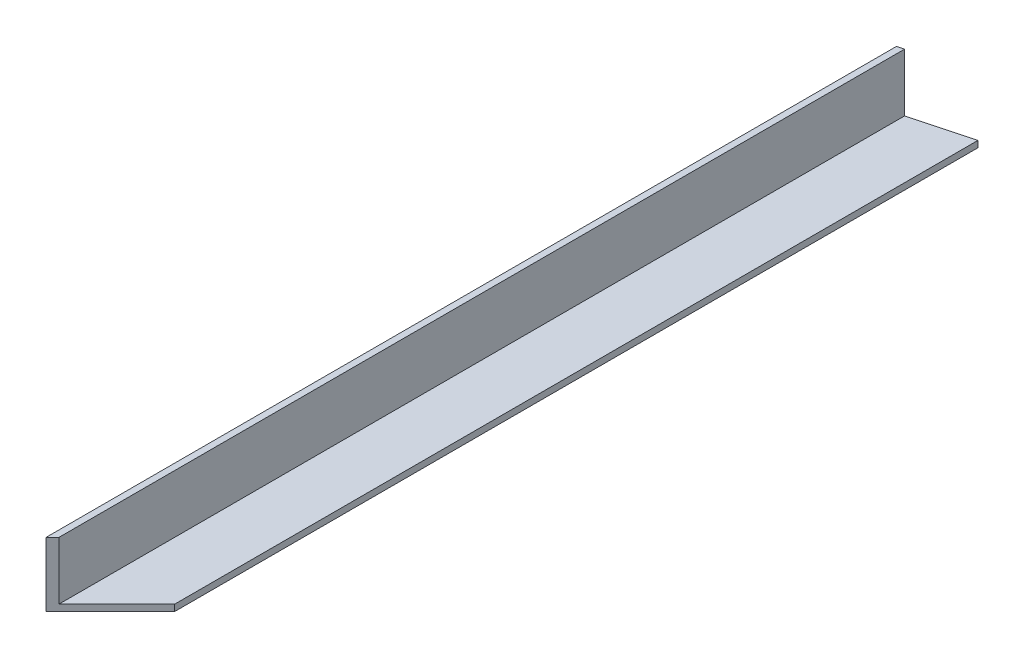
ISO-10303-21;
HEADER;
FILE_DESCRIPTION(('STEP AP214'),'2;1');
FILE_NAME('part.step','',(''),(''),'','','');
FILE_SCHEMA(('AUTOMOTIVE_DESIGN { 1 0 10303 214 1 1 1 1 }'));
ENDSEC;
DATA;
#1=APPLICATION_CONTEXT('core data for automotive mechanical design processes');
#2=APPLICATION_PROTOCOL_DEFINITION('international standard','automotive_design',2000,#1);
#3=PRODUCT_CONTEXT('',#1,'mechanical');
#4=PRODUCT('Part','Part','',(#3));
#5=PRODUCT_RELATED_PRODUCT_CATEGORY('part','',(#4));
#6=PRODUCT_DEFINITION_FORMATION('','',#4);
#7=PRODUCT_DEFINITION_CONTEXT('part definition',#1,'design');
#8=PRODUCT_DEFINITION('design','',#6,#7);
#9=PRODUCT_DEFINITION_SHAPE('','',#8);
#10=(LENGTH_UNIT() NAMED_UNIT(*) SI_UNIT(.MILLI.,.METRE.));
#11=(NAMED_UNIT(*) PLANE_ANGLE_UNIT() SI_UNIT($,.RADIAN.));
#12=(NAMED_UNIT(*) SI_UNIT($,.STERADIAN.) SOLID_ANGLE_UNIT());
#13=UNCERTAINTY_MEASURE_WITH_UNIT(LENGTH_MEASURE(1.E-05),#10,'distance_accuracy_value','');
#14=(GEOMETRIC_REPRESENTATION_CONTEXT(3) GLOBAL_UNCERTAINTY_ASSIGNED_CONTEXT((#13)) GLOBAL_UNIT_ASSIGNED_CONTEXT((#10,
#11,#12)) REPRESENTATION_CONTEXT('',''));
#15=CARTESIAN_POINT('',(0.,0.,0.));
#16=DIRECTION('',(0.,0.,1.));
#17=DIRECTION('',(1.,0.,0.));
#18=AXIS2_PLACEMENT_3D('',#15,#16,#17);
#19=CARTESIAN_POINT('',(12.7,0.,171.45));
#20=DIRECTION('',(0.,1.,0.));
#21=DIRECTION('',(-1.,0.,0.));
#22=AXIS2_PLACEMENT_3D('',#19,#20,#21);
#23=PLANE('',#22);
#24=DIRECTION('',(0.,0.,-1.));
#25=VECTOR('',#24,1.);
#26=CARTESIAN_POINT('',(12.7,0.,171.45));
#27=LINE('',#26,#25);
#28=CARTESIAN_POINT('',(12.7,0.,158.75));
#29=VERTEX_POINT('',#28);
#30=CARTESIAN_POINT('',(12.7,0.,0.));
#31=VERTEX_POINT('',#30);
#32=EDGE_CURVE('E11',#29,#31,#27,.T.);
#33=ORIENTED_EDGE('',*,*,#32,.F.);
#34=DIRECTION('',(-0.707106781186551,0.,0.707106781186544));
#35=VECTOR('',#34,1.);
#36=CARTESIAN_POINT('',(0.,0.,171.45));
#37=LINE('',#36,#35);
#38=CARTESIAN_POINT('',(0.,0.,171.45));
#39=VERTEX_POINT('',#38);
#40=EDGE_CURVE('E79',#29,#39,#37,.T.);
#41=ORIENTED_EDGE('',*,*,#40,.T.);
#42=DIRECTION('',(0.,0.,-1.));
#43=VECTOR('',#42,1.);
#44=CARTESIAN_POINT('',(0.,0.,171.45));
#45=LINE('',#44,#43);
#46=CARTESIAN_POINT('',(0.,0.,3.40295474387517));
#47=VERTEX_POINT('',#46);
#48=EDGE_CURVE('E100',#39,#47,#45,.T.);
#49=ORIENTED_EDGE('',*,*,#48,.T.);
#50=DIRECTION('',(0.96592582628907,0.,-0.258819045102514));
#51=VECTOR('',#50,1.);
#52=CARTESIAN_POINT('',(12.7,0.,0.));
#53=LINE('',#52,#51);
#54=EDGE_CURVE('E99',#47,#31,#53,.T.);
#55=ORIENTED_EDGE('',*,*,#54,.T.);
#56=EDGE_LOOP('',(#33,#41,#49,#55));
#57=FACE_BOUND('',#56,.T.);
#58=ADVANCED_FACE('F33',(#57),#23,.F.);
#59=CARTESIAN_POINT('',(12.7,1.27,171.45));
#60=DIRECTION('',(-1.,0.,0.));
#61=DIRECTION('',(0.,0.,1.));
#62=AXIS2_PLACEMENT_3D('',#59,#60,#61);
#63=PLANE('',#62);
#64=DIRECTION('',(0.,0.,-1.));
#65=VECTOR('',#64,1.);
#66=CARTESIAN_POINT('',(12.7,1.27,171.45));
#67=LINE('',#66,#65);
#68=CARTESIAN_POINT('',(12.7,1.27,158.75));
#69=VERTEX_POINT('',#68);
#70=CARTESIAN_POINT('',(12.7,1.27,0.));
#71=VERTEX_POINT('',#70);
#72=EDGE_CURVE('E41',#69,#71,#67,.T.);
#73=ORIENTED_EDGE('',*,*,#72,.F.);
#74=DIRECTION('',(0.,1.,0.));
#75=VECTOR('',#74,1.);
#76=CARTESIAN_POINT('',(12.7,0.,158.75));
#77=LINE('',#76,#75);
#78=EDGE_CURVE('E82',#29,#69,#77,.T.);
#79=ORIENTED_EDGE('',*,*,#78,.F.);
#80=ORIENTED_EDGE('',*,*,#32,.T.);
#81=DIRECTION('',(0.,1.,0.));
#82=VECTOR('',#81,1.);
#83=CARTESIAN_POINT('',(12.7,1.27,0.));
#84=LINE('',#83,#82);
#85=EDGE_CURVE('E119',#31,#71,#84,.T.);
#86=ORIENTED_EDGE('',*,*,#85,.T.);
#87=EDGE_LOOP('',(#73,#79,#80,#86));
#88=FACE_BOUND('',#87,.T.);
#89=ADVANCED_FACE('F93',(#88),#63,.F.);
#90=CARTESIAN_POINT('',(1.27,1.27,171.45));
#91=DIRECTION('',(0.,-1.,0.));
#92=DIRECTION('',(1.,0.,0.));
#93=AXIS2_PLACEMENT_3D('',#90,#91,#92);
#94=PLANE('',#93);
#95=DIRECTION('',(0.,0.,-1.));
#96=VECTOR('',#95,1.);
#97=CARTESIAN_POINT('',(1.27,1.27,171.45));
#98=LINE('',#97,#96);
#99=CARTESIAN_POINT('',(1.27,1.27,170.18));
#100=VERTEX_POINT('',#99);
#101=CARTESIAN_POINT('',(1.27,1.27,3.06265926948765));
#102=VERTEX_POINT('',#101);
#103=EDGE_CURVE('E129',#100,#102,#98,.T.);
#104=ORIENTED_EDGE('',*,*,#103,.F.);
#105=DIRECTION('',(0.707106781186551,0.,-0.707106781186544));
#106=VECTOR('',#105,1.);
#107=CARTESIAN_POINT('',(0.635000000000006,1.27,170.815));
#108=LINE('',#107,#106);
#109=EDGE_CURVE('E117',#100,#69,#108,.T.);
#110=ORIENTED_EDGE('',*,*,#109,.T.);
#111=ORIENTED_EDGE('',*,*,#72,.T.);
#112=DIRECTION('',(-0.96592582628907,0.,0.258819045102514));
#113=VECTOR('',#112,1.);
#114=CARTESIAN_POINT('',(-40.8268351826271,1.27,14.3424722605784));
#115=LINE('',#114,#113);
#116=EDGE_CURVE('E111',#71,#102,#115,.T.);
#117=ORIENTED_EDGE('',*,*,#116,.T.);
#118=EDGE_LOOP('',(#104,#110,#111,#117));
#119=FACE_BOUND('',#118,.T.);
#120=ADVANCED_FACE('F133',(#119),#94,.F.);
#121=CARTESIAN_POINT('',(1.27,12.7,171.45));
#122=DIRECTION('',(-1.,0.,0.));
#123=DIRECTION('',(0.,-1.,0.));
#124=AXIS2_PLACEMENT_3D('',#121,#122,#123);
#125=PLANE('',#124);
#126=DIRECTION('',(0.,0.,-1.));
#127=VECTOR('',#126,1.);
#128=CARTESIAN_POINT('',(1.27,12.7,171.45));
#129=LINE('',#128,#127);
#130=CARTESIAN_POINT('',(1.27,12.7,170.18));
#131=VERTEX_POINT('',#130);
#132=CARTESIAN_POINT('',(1.27,12.7,3.06265926948765));
#133=VERTEX_POINT('',#132);
#134=EDGE_CURVE('E126',#131,#133,#129,.T.);
#135=ORIENTED_EDGE('',*,*,#134,.F.);
#136=DIRECTION('',(0.,-1.,0.));
#137=VECTOR('',#136,1.);
#138=CARTESIAN_POINT('',(1.27,12.7,170.18));
#139=LINE('',#138,#137);
#140=EDGE_CURVE('E114',#131,#100,#139,.T.);
#141=ORIENTED_EDGE('',*,*,#140,.T.);
#142=ORIENTED_EDGE('',*,*,#103,.T.);
#143=DIRECTION('',(0.,1.,0.));
#144=VECTOR('',#143,1.);
#145=CARTESIAN_POINT('',(1.27,12.7,3.06265926948765));
#146=LINE('',#145,#144);
#147=EDGE_CURVE('E96',#102,#133,#146,.T.);
#148=ORIENTED_EDGE('',*,*,#147,.T.);
#149=EDGE_LOOP('',(#135,#141,#142,#148));
#150=FACE_BOUND('',#149,.T.);
#151=ADVANCED_FACE('F138',(#150),#125,.F.);
#152=CARTESIAN_POINT('',(0.,12.7,171.45));
#153=DIRECTION('',(0.,-1.,0.));
#154=DIRECTION('',(0.,0.,-1.));
#155=AXIS2_PLACEMENT_3D('',#152,#153,#154);
#156=PLANE('',#155);
#157=DIRECTION('',(0.,0.,-1.));
#158=VECTOR('',#157,1.);
#159=CARTESIAN_POINT('',(0.,12.7,171.45));
#160=LINE('',#159,#158);
#161=CARTESIAN_POINT('',(0.,12.7,171.45));
#162=VERTEX_POINT('',#161);
#163=CARTESIAN_POINT('',(0.,12.7,3.40295474387517));
#164=VERTEX_POINT('',#163);
#165=EDGE_CURVE('E123',#162,#164,#160,.T.);
#166=ORIENTED_EDGE('',*,*,#165,.F.);
#167=DIRECTION('',(-0.707106781186551,0.,0.707106781186544));
#168=VECTOR('',#167,1.);
#169=CARTESIAN_POINT('',(0.,12.7,171.45));
#170=LINE('',#169,#168);
#171=EDGE_CURVE('E47',#131,#162,#170,.T.);
#172=ORIENTED_EDGE('',*,*,#171,.F.);
#173=ORIENTED_EDGE('',*,*,#134,.T.);
#174=DIRECTION('',(0.96592582628907,0.,-0.258819045102514));
#175=VECTOR('',#174,1.);
#176=CARTESIAN_POINT('',(12.7,12.7,0.));
#177=LINE('',#176,#175);
#178=EDGE_CURVE('E104',#164,#133,#177,.T.);
#179=ORIENTED_EDGE('',*,*,#178,.F.);
#180=EDGE_LOOP('',(#166,#172,#173,#179));
#181=FACE_BOUND('',#180,.T.);
#182=ADVANCED_FACE('F140',(#181),#156,.F.);
#183=CARTESIAN_POINT('',(0.,0.,171.45));
#184=DIRECTION('',(1.,0.,0.));
#185=DIRECTION('',(0.,0.,-1.));
#186=AXIS2_PLACEMENT_3D('',#183,#184,#185);
#187=PLANE('',#186);
#188=ORIENTED_EDGE('',*,*,#165,.T.);
#189=DIRECTION('',(0.,1.,0.));
#190=VECTOR('',#189,1.);
#191=CARTESIAN_POINT('',(0.,0.,3.40295474387517));
#192=LINE('',#191,#190);
#193=EDGE_CURVE('E103',#47,#164,#192,.T.);
#194=ORIENTED_EDGE('',*,*,#193,.F.);
#195=ORIENTED_EDGE('',*,*,#48,.F.);
#196=DIRECTION('',(0.,-1.,0.));
#197=VECTOR('',#196,1.);
#198=CARTESIAN_POINT('',(0.,0.,171.45));
#199=LINE('',#198,#197);
#200=EDGE_CURVE('E85',#162,#39,#199,.T.);
#201=ORIENTED_EDGE('',*,*,#200,.F.);
#202=EDGE_LOOP('',(#188,#194,#195,#201));
#203=FACE_BOUND('',#202,.T.);
#204=ADVANCED_FACE('F143',(#203),#187,.F.);
#205=CARTESIAN_POINT('',(12.7,0.,0.));
#206=DIRECTION('',(0.258819045102514,0.,0.96592582628907));
#207=DIRECTION('',(0.96592582628907,0.,-0.258819045102514));
#208=AXIS2_PLACEMENT_3D('',#205,#206,#207);
#209=PLANE('',#208);
#210=ORIENTED_EDGE('',*,*,#85,.F.);
#211=ORIENTED_EDGE('',*,*,#54,.F.);
#212=ORIENTED_EDGE('',*,*,#193,.T.);
#213=ORIENTED_EDGE('',*,*,#178,.T.);
#214=ORIENTED_EDGE('',*,*,#147,.F.);
#215=ORIENTED_EDGE('',*,*,#116,.F.);
#216=EDGE_LOOP('',(#210,#211,#212,#213,#214,#215));
#217=FACE_BOUND('',#216,.T.);
#218=ADVANCED_FACE('F134',(#217),#209,.F.);
#219=CARTESIAN_POINT('',(0.,0.,171.45));
#220=DIRECTION('',(-0.707106781186544,0.,-0.707106781186551));
#221=DIRECTION('',(-0.707106781186551,0.,0.707106781186544));
#222=AXIS2_PLACEMENT_3D('',#219,#220,#221);
#223=PLANE('',#222);
#224=ORIENTED_EDGE('',*,*,#140,.F.);
#225=ORIENTED_EDGE('',*,*,#171,.T.);
#226=ORIENTED_EDGE('',*,*,#200,.T.);
#227=ORIENTED_EDGE('',*,*,#40,.F.);
#228=ORIENTED_EDGE('',*,*,#78,.T.);
#229=ORIENTED_EDGE('',*,*,#109,.F.);
#230=EDGE_LOOP('',(#224,#225,#226,#227,#228,#229));
#231=FACE_BOUND('',#230,.T.);
#232=ADVANCED_FACE('F81',(#231),#223,.F.);
#233=CLOSED_SHELL('',(#58,#89,#120,#151,#182,#204,#218,#232));
#234=MANIFOLD_SOLID_BREP('B2',#233);
#235=ADVANCED_BREP_SHAPE_REPRESENTATION('',(#18,#234),#14);
#236=SHAPE_DEFINITION_REPRESENTATION(#9,#235);
ENDSEC;
END-ISO-10303-21;
